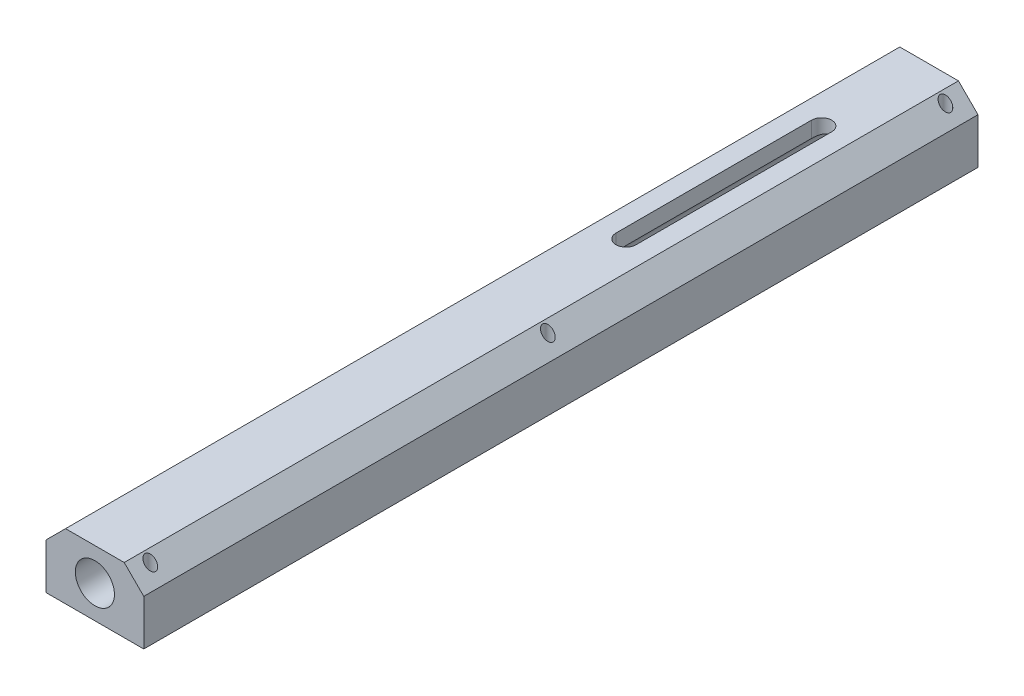
ISO-10303-21;
HEADER;
FILE_DESCRIPTION(('STEP AP214'),'2;1');
FILE_NAME('part.step','',(''),(''),'','','');
FILE_SCHEMA(('AUTOMOTIVE_DESIGN { 1 0 10303 214 1 1 1 1 }'));
ENDSEC;
DATA;
#1=APPLICATION_CONTEXT('core data for automotive mechanical design processes');
#2=APPLICATION_PROTOCOL_DEFINITION('international standard','automotive_design',2000,#1);
#3=PRODUCT_CONTEXT('',#1,'mechanical');
#4=PRODUCT('Part','Part','',(#3));
#5=PRODUCT_RELATED_PRODUCT_CATEGORY('part','',(#4));
#6=PRODUCT_DEFINITION_FORMATION('','',#4);
#7=PRODUCT_DEFINITION_CONTEXT('part definition',#1,'design');
#8=PRODUCT_DEFINITION('design','',#6,#7);
#9=PRODUCT_DEFINITION_SHAPE('','',#8);
#10=(LENGTH_UNIT() NAMED_UNIT(*) SI_UNIT(.MILLI.,.METRE.));
#11=(NAMED_UNIT(*) PLANE_ANGLE_UNIT() SI_UNIT($,.RADIAN.));
#12=(NAMED_UNIT(*) SI_UNIT($,.STERADIAN.) SOLID_ANGLE_UNIT());
#13=UNCERTAINTY_MEASURE_WITH_UNIT(LENGTH_MEASURE(1.E-05),#10,'distance_accuracy_value','');
#14=(GEOMETRIC_REPRESENTATION_CONTEXT(3) GLOBAL_UNCERTAINTY_ASSIGNED_CONTEXT((#13)) GLOBAL_UNIT_ASSIGNED_CONTEXT((#10,
#11,#12)) REPRESENTATION_CONTEXT('',''));
#15=CARTESIAN_POINT('',(0.,0.,0.));
#16=DIRECTION('',(0.,0.,1.));
#17=DIRECTION('',(1.,0.,0.));
#18=AXIS2_PLACEMENT_3D('',#15,#16,#17);
#19=CARTESIAN_POINT('',(-7.5,-5.,128.));
#20=DIRECTION('',(0.,1.,0.));
#21=DIRECTION('',(0.,0.,1.));
#22=AXIS2_PLACEMENT_3D('',#19,#20,#21);
#23=PLANE('',#22);
#24=CARTESIAN_POINT('',(-5.5,-5.,3.));
#25=DIRECTION('',(0.,-1.,0.));
#26=DIRECTION('',(0.,0.,-1.));
#27=AXIS2_PLACEMENT_3D('',#24,#25,#26);
#28=CIRCLE('',#27,0.799999999999999);
#29=CARTESIAN_POINT('',(-5.5,-5.,2.2));
#30=VERTEX_POINT('',#29);
#31=EDGE_CURVE('E555',#30,#30,#28,.T.);
#32=ORIENTED_EDGE('',*,*,#31,.F.);
#33=EDGE_LOOP('',(#32));
#34=FACE_BOUND('',#33,.T.);
#35=CARTESIAN_POINT('',(5.5,-5.,64.));
#36=DIRECTION('',(0.,-1.,0.));
#37=DIRECTION('',(0.,0.,-1.));
#38=AXIS2_PLACEMENT_3D('',#35,#36,#37);
#39=CIRCLE('',#38,0.799999999999999);
#40=CARTESIAN_POINT('',(5.5,-5.,63.2));
#41=VERTEX_POINT('',#40);
#42=EDGE_CURVE('E563',#41,#41,#39,.T.);
#43=ORIENTED_EDGE('',*,*,#42,.F.);
#44=EDGE_LOOP('',(#43));
#45=FACE_BOUND('',#44,.T.);
#46=CARTESIAN_POINT('',(-5.5,-5.,64.));
#47=DIRECTION('',(0.,-1.,0.));
#48=DIRECTION('',(0.,0.,-1.));
#49=AXIS2_PLACEMENT_3D('',#46,#47,#48);
#50=CIRCLE('',#49,0.799999999999999);
#51=CARTESIAN_POINT('',(-5.5,-5.,63.2));
#52=VERTEX_POINT('',#51);
#53=EDGE_CURVE('E567',#52,#52,#50,.T.);
#54=ORIENTED_EDGE('',*,*,#53,.F.);
#55=EDGE_LOOP('',(#54));
#56=FACE_BOUND('',#55,.T.);
#57=CARTESIAN_POINT('',(5.5,-5.,125.));
#58=DIRECTION('',(0.,-1.,0.));
#59=DIRECTION('',(0.,0.,-1.));
#60=AXIS2_PLACEMENT_3D('',#57,#58,#59);
#61=CIRCLE('',#60,0.799999999999999);
#62=CARTESIAN_POINT('',(5.5,-5.,124.2));
#63=VERTEX_POINT('',#62);
#64=EDGE_CURVE('E573',#63,#63,#61,.T.);
#65=ORIENTED_EDGE('',*,*,#64,.F.);
#66=EDGE_LOOP('',(#65));
#67=FACE_BOUND('',#66,.T.);
#68=CARTESIAN_POINT('',(-5.5,-5.,125.));
#69=DIRECTION('',(0.,-1.,0.));
#70=DIRECTION('',(0.,0.,-1.));
#71=AXIS2_PLACEMENT_3D('',#68,#69,#70);
#72=CIRCLE('',#71,0.799999999999999);
#73=CARTESIAN_POINT('',(-5.5,-5.,124.2));
#74=VERTEX_POINT('',#73);
#75=EDGE_CURVE('E576',#74,#74,#72,.T.);
#76=ORIENTED_EDGE('',*,*,#75,.F.);
#77=EDGE_LOOP('',(#76));
#78=FACE_BOUND('',#77,.T.);
#79=DIRECTION('',(0.,0.,-1.));
#80=VECTOR('',#79,1.);
#81=CARTESIAN_POINT('',(1.55,-5.,16.5));
#82=LINE('',#81,#80);
#83=CARTESIAN_POINT('',(1.55,-5.,46.5));
#84=VERTEX_POINT('',#83);
#85=CARTESIAN_POINT('',(1.55,-5.,16.5));
#86=VERTEX_POINT('',#85);
#87=EDGE_CURVE('E165',#84,#86,#82,.T.);
#88=ORIENTED_EDGE('',*,*,#87,.T.);
#89=CARTESIAN_POINT('',(0.,-5.,16.5));
#90=DIRECTION('',(0.,1.,0.));
#91=DIRECTION('',(0.,0.,1.));
#92=AXIS2_PLACEMENT_3D('',#89,#90,#91);
#93=CIRCLE('',#92,1.55);
#94=CARTESIAN_POINT('',(-1.55,-5.,16.5));
#95=VERTEX_POINT('',#94);
#96=EDGE_CURVE('E144',#86,#95,#93,.T.);
#97=ORIENTED_EDGE('',*,*,#96,.T.);
#98=DIRECTION('',(0.,0.,1.));
#99=VECTOR('',#98,1.);
#100=CARTESIAN_POINT('',(-1.55,-5.,16.5));
#101=LINE('',#100,#99);
#102=CARTESIAN_POINT('',(-1.55,-5.,46.5));
#103=VERTEX_POINT('',#102);
#104=EDGE_CURVE('E155',#95,#103,#101,.T.);
#105=ORIENTED_EDGE('',*,*,#104,.T.);
#106=CARTESIAN_POINT('',(0.,-5.,46.5));
#107=DIRECTION('',(0.,1.,0.));
#108=DIRECTION('',(0.,0.,1.));
#109=AXIS2_PLACEMENT_3D('',#106,#107,#108);
#110=CIRCLE('',#109,1.55);
#111=EDGE_CURVE('E161',#103,#84,#110,.T.);
#112=ORIENTED_EDGE('',*,*,#111,.T.);
#113=EDGE_LOOP('',(#88,#97,#105,#112));
#114=FACE_BOUND('',#113,.T.);
#115=DIRECTION('',(1.,0.,0.));
#116=VECTOR('',#115,1.);
#117=CARTESIAN_POINT('',(-7.5,-5.,0.));
#118=LINE('',#117,#116);
#119=CARTESIAN_POINT('',(-7.5,-5.,0.));
#120=VERTEX_POINT('',#119);
#121=CARTESIAN_POINT('',(7.5,-5.,0.));
#122=VERTEX_POINT('',#121);
#123=EDGE_CURVE('E210',#120,#122,#118,.T.);
#124=ORIENTED_EDGE('',*,*,#123,.T.);
#125=DIRECTION('',(0.,0.,-1.));
#126=VECTOR('',#125,1.);
#127=CARTESIAN_POINT('',(7.5,-5.,128.));
#128=LINE('',#127,#126);
#129=CARTESIAN_POINT('',(7.5,-5.,128.));
#130=VERTEX_POINT('',#129);
#131=EDGE_CURVE('E208',#130,#122,#128,.T.);
#132=ORIENTED_EDGE('',*,*,#131,.F.);
#133=DIRECTION('',(1.,0.,0.));
#134=VECTOR('',#133,1.);
#135=CARTESIAN_POINT('',(-7.5,-5.,128.));
#136=LINE('',#135,#134);
#137=CARTESIAN_POINT('',(-7.5,-5.,128.));
#138=VERTEX_POINT('',#137);
#139=EDGE_CURVE('E201',#138,#130,#136,.T.);
#140=ORIENTED_EDGE('',*,*,#139,.F.);
#141=DIRECTION('',(0.,0.,-1.));
#142=VECTOR('',#141,1.);
#143=CARTESIAN_POINT('',(-7.5,-5.,128.));
#144=LINE('',#143,#142);
#145=EDGE_CURVE('E218',#138,#120,#144,.T.);
#146=ORIENTED_EDGE('',*,*,#145,.T.);
#147=EDGE_LOOP('',(#124,#132,#140,#146));
#148=FACE_BOUND('',#147,.T.);
#149=CARTESIAN_POINT('',(5.5,-5.,3.));
#150=DIRECTION('',(0.,-1.,0.));
#151=DIRECTION('',(0.,0.,-1.));
#152=AXIS2_PLACEMENT_3D('',#149,#150,#151);
#153=CIRCLE('',#152,0.799999999999999);
#154=CARTESIAN_POINT('',(5.5,-5.,2.2));
#155=VERTEX_POINT('',#154);
#156=EDGE_CURVE('E553',#155,#155,#153,.T.);
#157=ORIENTED_EDGE('',*,*,#156,.F.);
#158=EDGE_LOOP('',(#157));
#159=FACE_BOUND('',#158,.T.);
#160=ADVANCED_FACE('F35',(#34,#45,#56,#67,#78,#114,#148,#159),#23,.F.);
#161=CARTESIAN_POINT('',(-7.5,5.,128.));
#162=DIRECTION('',(1.,0.,0.));
#163=DIRECTION('',(0.,1.,0.));
#164=AXIS2_PLACEMENT_3D('',#161,#162,#163);
#165=PLANE('',#164);
#166=DIRECTION('',(0.,-1.,0.));
#167=VECTOR('',#166,1.);
#168=CARTESIAN_POINT('',(-7.5,5.,128.));
#169=LINE('',#168,#167);
#170=CARTESIAN_POINT('',(-7.5,2.,128.));
#171=VERTEX_POINT('',#170);
#172=EDGE_CURVE('E199',#171,#138,#169,.T.);
#173=ORIENTED_EDGE('',*,*,#172,.F.);
#174=DIRECTION('',(0.,0.,-1.));
#175=VECTOR('',#174,1.);
#176=CARTESIAN_POINT('',(-7.5,2.,128.));
#177=LINE('',#176,#175);
#178=CARTESIAN_POINT('',(-7.5,2.,0.));
#179=VERTEX_POINT('',#178);
#180=EDGE_CURVE('E11',#171,#179,#177,.T.);
#181=ORIENTED_EDGE('',*,*,#180,.T.);
#182=DIRECTION('',(0.,-1.,0.));
#183=VECTOR('',#182,1.);
#184=CARTESIAN_POINT('',(-7.5,5.,0.));
#185=LINE('',#184,#183);
#186=EDGE_CURVE('E196',#179,#120,#185,.T.);
#187=ORIENTED_EDGE('',*,*,#186,.T.);
#188=ORIENTED_EDGE('',*,*,#145,.F.);
#189=EDGE_LOOP('',(#173,#181,#187,#188));
#190=FACE_BOUND('',#189,.T.);
#191=ADVANCED_FACE('F306',(#190),#165,.F.);
#192=CARTESIAN_POINT('',(7.5,5.,128.));
#193=DIRECTION('',(-1.,0.,0.));
#194=DIRECTION('',(0.,-1.,0.));
#195=AXIS2_PLACEMENT_3D('',#192,#193,#194);
#196=PLANE('',#195);
#197=DIRECTION('',(0.,1.,0.));
#198=VECTOR('',#197,1.);
#199=CARTESIAN_POINT('',(7.5,5.,0.));
#200=LINE('',#199,#198);
#201=CARTESIAN_POINT('',(7.5,2.,0.));
#202=VERTEX_POINT('',#201);
#203=EDGE_CURVE('E212',#122,#202,#200,.T.);
#204=ORIENTED_EDGE('',*,*,#203,.T.);
#205=DIRECTION('',(0.,0.,1.));
#206=VECTOR('',#205,1.);
#207=CARTESIAN_POINT('',(7.5,2.,128.));
#208=LINE('',#207,#206);
#209=CARTESIAN_POINT('',(7.5,2.,128.));
#210=VERTEX_POINT('',#209);
#211=EDGE_CURVE('E58',#202,#210,#208,.T.);
#212=ORIENTED_EDGE('',*,*,#211,.T.);
#213=DIRECTION('',(0.,1.,0.));
#214=VECTOR('',#213,1.);
#215=CARTESIAN_POINT('',(7.5,5.,128.));
#216=LINE('',#215,#214);
#217=EDGE_CURVE('E204',#130,#210,#216,.T.);
#218=ORIENTED_EDGE('',*,*,#217,.F.);
#219=ORIENTED_EDGE('',*,*,#131,.T.);
#220=EDGE_LOOP('',(#204,#212,#218,#219));
#221=FACE_BOUND('',#220,.T.);
#222=ADVANCED_FACE('F312',(#221),#196,.F.);
#223=CARTESIAN_POINT('',(-7.5,5.,128.));
#224=DIRECTION('',(0.,-1.,0.));
#225=DIRECTION('',(1.,0.,0.));
#226=AXIS2_PLACEMENT_3D('',#223,#224,#225);
#227=PLANE('',#226);
#228=DIRECTION('',(0.,0.,1.));
#229=VECTOR('',#228,1.);
#230=CARTESIAN_POINT('',(-1.55,5.,16.5));
#231=LINE('',#230,#229);
#232=CARTESIAN_POINT('',(-1.55,5.,16.5));
#233=VERTEX_POINT('',#232);
#234=CARTESIAN_POINT('',(-1.55,5.,46.5));
#235=VERTEX_POINT('',#234);
#236=EDGE_CURVE('E179',#233,#235,#231,.T.);
#237=ORIENTED_EDGE('',*,*,#236,.F.);
#238=CARTESIAN_POINT('',(0.,5.,16.5));
#239=DIRECTION('',(0.,1.,0.));
#240=DIRECTION('',(0.,0.,1.));
#241=AXIS2_PLACEMENT_3D('',#238,#239,#240);
#242=CIRCLE('',#241,1.55);
#243=CARTESIAN_POINT('',(1.55,5.,16.5));
#244=VERTEX_POINT('',#243);
#245=EDGE_CURVE('E177',#244,#233,#242,.T.);
#246=ORIENTED_EDGE('',*,*,#245,.F.);
#247=DIRECTION('',(0.,0.,-1.));
#248=VECTOR('',#247,1.);
#249=CARTESIAN_POINT('',(1.55,5.,16.5));
#250=LINE('',#249,#248);
#251=CARTESIAN_POINT('',(1.55,5.,46.5));
#252=VERTEX_POINT('',#251);
#253=EDGE_CURVE('E166',#252,#244,#250,.T.);
#254=ORIENTED_EDGE('',*,*,#253,.F.);
#255=CARTESIAN_POINT('',(0.,5.,46.5));
#256=DIRECTION('',(0.,1.,0.));
#257=DIRECTION('',(0.,0.,1.));
#258=AXIS2_PLACEMENT_3D('',#255,#256,#257);
#259=CIRCLE('',#258,1.55);
#260=EDGE_CURVE('E169',#235,#252,#259,.T.);
#261=ORIENTED_EDGE('',*,*,#260,.F.);
#262=EDGE_LOOP('',(#237,#246,#254,#261));
#263=FACE_BOUND('',#262,.T.);
#264=DIRECTION('',(-1.,0.,0.));
#265=VECTOR('',#264,1.);
#266=CARTESIAN_POINT('',(-7.5,5.,128.));
#267=LINE('',#266,#265);
#268=CARTESIAN_POINT('',(4.5,5.,128.));
#269=VERTEX_POINT('',#268);
#270=CARTESIAN_POINT('',(-4.49999999999998,5.,128.));
#271=VERTEX_POINT('',#270);
#272=EDGE_CURVE('E206',#269,#271,#267,.T.);
#273=ORIENTED_EDGE('',*,*,#272,.F.);
#274=DIRECTION('',(0.,0.,-1.));
#275=VECTOR('',#274,1.);
#276=CARTESIAN_POINT('',(4.5,5.,128.));
#277=LINE('',#276,#275);
#278=CARTESIAN_POINT('',(4.5,5.,0.));
#279=VERTEX_POINT('',#278);
#280=EDGE_CURVE('E341',#269,#279,#277,.T.);
#281=ORIENTED_EDGE('',*,*,#280,.T.);
#282=DIRECTION('',(-1.,0.,0.));
#283=VECTOR('',#282,1.);
#284=CARTESIAN_POINT('',(-7.5,5.,0.));
#285=LINE('',#284,#283);
#286=CARTESIAN_POINT('',(-4.49999999999998,5.,0.));
#287=VERTEX_POINT('',#286);
#288=EDGE_CURVE('E202',#279,#287,#285,.T.);
#289=ORIENTED_EDGE('',*,*,#288,.T.);
#290=DIRECTION('',(0.,0.,1.));
#291=VECTOR('',#290,1.);
#292=CARTESIAN_POINT('',(-4.49999999999998,5.,128.));
#293=LINE('',#292,#291);
#294=EDGE_CURVE('E265',#287,#271,#293,.T.);
#295=ORIENTED_EDGE('',*,*,#294,.T.);
#296=EDGE_LOOP('',(#273,#281,#289,#295));
#297=FACE_BOUND('',#296,.T.);
#298=ADVANCED_FACE('F289',(#263,#297),#227,.F.);
#299=CARTESIAN_POINT('',(0.,0.,128.));
#300=DIRECTION('',(0.,0.,1.));
#301=DIRECTION('',(1.,0.,0.));
#302=AXIS2_PLACEMENT_3D('',#299,#300,#301);
#303=PLANE('',#302);
#304=CARTESIAN_POINT('',(0.,0.,128.));
#305=DIRECTION('',(0.,0.,1.));
#306=DIRECTION('',(1.,0.,0.));
#307=AXIS2_PLACEMENT_3D('',#304,#305,#306);
#308=CIRCLE('',#307,3.);
#309=CARTESIAN_POINT('',(3.,0.,128.));
#310=VERTEX_POINT('',#309);
#311=EDGE_CURVE('E186',#310,#310,#308,.T.);
#312=ORIENTED_EDGE('',*,*,#311,.F.);
#313=EDGE_LOOP('',(#312));
#314=FACE_BOUND('',#313,.T.);
#315=ORIENTED_EDGE('',*,*,#217,.T.);
#316=DIRECTION('',(0.707106781186548,-0.707106781186547,0.));
#317=VECTOR('',#316,1.);
#318=CARTESIAN_POINT('',(4.75,4.75,128.));
#319=LINE('',#318,#317);
#320=EDGE_CURVE('E43',#210,#269,#319,.F.);
#321=ORIENTED_EDGE('',*,*,#320,.T.);
#322=ORIENTED_EDGE('',*,*,#272,.T.);
#323=DIRECTION('',(0.707106781186549,0.707106781186546,0.));
#324=VECTOR('',#323,1.);
#325=CARTESIAN_POINT('',(-4.74999999999998,4.75,128.));
#326=LINE('',#325,#324);
#327=EDGE_CURVE('E50',#271,#171,#326,.F.);
#328=ORIENTED_EDGE('',*,*,#327,.T.);
#329=ORIENTED_EDGE('',*,*,#172,.T.);
#330=ORIENTED_EDGE('',*,*,#139,.T.);
#331=EDGE_LOOP('',(#315,#321,#322,#328,#329,#330));
#332=FACE_BOUND('',#331,.T.);
#333=ADVANCED_FACE('F352',(#314,#332),#303,.T.);
#334=CARTESIAN_POINT('',(0.,0.,0.));
#335=DIRECTION('',(0.,0.,1.));
#336=DIRECTION('',(1.,0.,0.));
#337=AXIS2_PLACEMENT_3D('',#334,#335,#336);
#338=PLANE('',#337);
#339=CARTESIAN_POINT('',(0.,0.,0.));
#340=DIRECTION('',(0.,0.,1.));
#341=DIRECTION('',(1.,0.,0.));
#342=AXIS2_PLACEMENT_3D('',#339,#340,#341);
#343=CIRCLE('',#342,3.);
#344=CARTESIAN_POINT('',(3.,0.,0.));
#345=VERTEX_POINT('',#344);
#346=EDGE_CURVE('E193',#345,#345,#343,.T.);
#347=ORIENTED_EDGE('',*,*,#346,.T.);
#348=EDGE_LOOP('',(#347));
#349=FACE_BOUND('',#348,.T.);
#350=ORIENTED_EDGE('',*,*,#288,.F.);
#351=DIRECTION('',(-0.707106781186548,0.707106781186547,0.));
#352=VECTOR('',#351,1.);
#353=CARTESIAN_POINT('',(4.5,5.,0.));
#354=LINE('',#353,#352);
#355=EDGE_CURVE('E346',#279,#202,#354,.F.);
#356=ORIENTED_EDGE('',*,*,#355,.T.);
#357=ORIENTED_EDGE('',*,*,#203,.F.);
#358=ORIENTED_EDGE('',*,*,#123,.F.);
#359=ORIENTED_EDGE('',*,*,#186,.F.);
#360=DIRECTION('',(-0.707106781186549,-0.707106781186546,0.));
#361=VECTOR('',#360,1.);
#362=CARTESIAN_POINT('',(-7.5,2.,0.));
#363=LINE('',#362,#361);
#364=EDGE_CURVE('E348',#179,#287,#363,.F.);
#365=ORIENTED_EDGE('',*,*,#364,.T.);
#366=EDGE_LOOP('',(#350,#356,#357,#358,#359,#365));
#367=FACE_BOUND('',#366,.T.);
#368=ADVANCED_FACE('F301',(#349,#367),#338,.F.);
#369=CARTESIAN_POINT('',(0.,0.,0.));
#370=DIRECTION('',(0.,0.,1.));
#371=DIRECTION('',(1.,0.,0.));
#372=AXIS2_PLACEMENT_3D('',#369,#370,#371);
#373=CYLINDRICAL_SURFACE('',#372,3.);
#374=DIRECTION('',(0.,0.,1.));
#375=VECTOR('',#374,1.);
#376=CARTESIAN_POINT('',(-1.55,-2.56855990780826,0.));
#377=LINE('',#376,#375);
#378=CARTESIAN_POINT('',(-1.55,-2.56855990780826,46.5));
#379=VERTEX_POINT('',#378);
#380=CARTESIAN_POINT('',(-1.55,-2.56855990780826,16.5));
#381=VERTEX_POINT('',#380);
#382=EDGE_CURVE('E258',#379,#381,#377,.F.);
#383=ORIENTED_EDGE('',*,*,#382,.T.);
#384=CARTESIAN_POINT('',(-1.55,-2.56855990780827,16.5));
#385=CARTESIAN_POINT('',(-1.55000325911588,-2.56855131423425,16.4596078876841));
#386=CARTESIAN_POINT('',(-1.54842008811431,-2.56951386249306,16.4192390917681));
#387=CARTESIAN_POINT('',(-1.54212741895229,-2.57329822025658,16.3388598777798));
#388=CARTESIAN_POINT('',(-1.53741999562099,-2.57611879582824,16.2988492397135));
#389=CARTESIAN_POINT('',(-1.51876441125574,-2.58719380973226,16.180291011719));
#390=CARTESIAN_POINT('',(-1.50028142727033,-2.59806386562294,16.102650076527));
#391=CARTESIAN_POINT('',(-1.45213430707905,-2.62527236683728,15.9522354959461));
#392=CARTESIAN_POINT('',(-1.42249519712639,-2.64159856341572,15.879451382453));
#393=CARTESIAN_POINT('',(-1.35301847357807,-2.67784913898162,15.7397793093859));
#394=CARTESIAN_POINT('',(-1.31316392625474,-2.69777947609884,15.6729013901898));
#395=CARTESIAN_POINT('',(-1.22031605513712,-2.74110798751298,15.5406144853931));
#396=CARTESIAN_POINT('',(-1.16647703042271,-2.76465700129495,15.4758486235379));
#397=CARTESIAN_POINT('',(-1.04895271944088,-2.81135151947642,15.3557715609075));
#398=CARTESIAN_POINT('',(-0.98526463652275,-2.83449690718219,15.3004630549809));
#399=CARTESIAN_POINT('',(-0.844142452160648,-2.87980934357678,15.1968769357708));
#400=CARTESIAN_POINT('',(-0.766042920809648,-2.90178028688266,15.1494119764151));
#401=CARTESIAN_POINT('',(-0.601617574598474,-2.94026599826775,15.0685914761812));
#402=CARTESIAN_POINT('',(-0.515297248157472,-2.95678437417448,15.0352266015164));
#403=CARTESIAN_POINT('',(-0.34375206688228,-2.98140389219349,14.9861692239297));
#404=CARTESIAN_POINT('',(-0.258932261408523,-2.9900442406009,14.9693372010971));
#405=CARTESIAN_POINT('',(-0.0872666005139904,-2.99995963001846,14.9500546830422));
#406=CARTESIAN_POINT('',(-0.000422071868088985,-3.00123936530146,14.9475950217486));
#407=CARTESIAN_POINT('',(0.164195057750389,-2.99653015703522,14.9567240151537));
#408=CARTESIAN_POINT('',(0.242062319378158,-2.99120404970563,14.9670314756814));
#409=CARTESIAN_POINT('',(0.394776661551257,-2.97490323334359,14.9990871633236));
#410=CARTESIAN_POINT('',(0.469623570628814,-2.96392820410257,15.0208360389951));
#411=CARTESIAN_POINT('',(0.615422938252004,-2.93714586364805,15.0752570752933));
#412=CARTESIAN_POINT('',(0.686312023038214,-2.92127751222654,15.108067734648));
#413=CARTESIAN_POINT('',(0.82174138285225,-2.88611217091073,15.1834686918018));
#414=CARTESIAN_POINT('',(0.886279356221716,-2.86681394507912,15.2260625165362));
#415=CARTESIAN_POINT('',(1.01399918830875,-2.82431789095171,15.3246519701554));
#416=CARTESIAN_POINT('',(1.07641384441618,-2.80092314165808,15.3815570598368));
#417=CARTESIAN_POINT('',(1.19125227241975,-2.75404674097164,15.5047517623613));
#418=CARTESIAN_POINT('',(1.24366598862783,-2.73056502606201,15.5710507050121));
#419=CARTESIAN_POINT('',(1.34071242939525,-2.68432207722154,15.716925629798));
#420=CARTESIAN_POINT('',(1.38451545502006,-2.66173384653833,15.7971133170293));
#421=CARTESIAN_POINT('',(1.45762700884423,-2.62241472617311,15.9650553567338));
#422=CARTESIAN_POINT('',(1.48697245596951,-2.60566894946495,16.0527897570749));
#423=CARTESIAN_POINT('',(1.52205775937805,-2.5852660389101,16.201002761933));
#424=CARTESIAN_POINT('',(1.53248306834913,-2.57907121725935,16.2600524446571));
#425=CARTESIAN_POINT('',(1.54647591927963,-2.57068715872253,16.3793762417494));
#426=CARTESIAN_POINT('',(1.55002698130994,-2.56850754827887,16.4396529493452));
#427=CARTESIAN_POINT('',(1.55,-2.56855990780827,16.5));
#428=B_SPLINE_CURVE_WITH_KNOTS('',3,(#384,#385,#386,#387,#388,#389,#390,#391,#392,#393,#394,
#395,#396,#397,#398,#399,#400,#401,#402,#403,#404,#405,#406,#407,#408,#409,#410,#411,#412,#413,
#414,#415,#416,#417,#418,#419,#420,#421,#422,#423,#424,#425,#426,#427),.UNSPECIFIED.,.F.,.F.,(4,
2,2,2,2,2,2,2,2,2,2,2,2,2,2,2,2,2,2,2,2,4),(0.,0.121089655469636,0.242098975147689,
0.482441190309218,0.722247434441772,0.962453796158042,1.22372481440542,1.48507015752429,
1.76557423720221,2.04589234055143,2.30514741615097,2.5642371320039,2.79930824264188,
3.03439267972971,3.27253710895289,3.51076752690893,3.77258967543859,4.03467370795555,
4.31558938422592,4.59578394620296,4.7761268586752,4.95690158217857),.UNSPECIFIED.);
#429=CARTESIAN_POINT('',(1.55,-2.56855990780827,16.5));
#430=VERTEX_POINT('',#429);
#431=EDGE_CURVE('E147',#381,#430,#428,.T.);
#432=ORIENTED_EDGE('',*,*,#431,.T.);
#433=DIRECTION('',(0.,0.,1.));
#434=VECTOR('',#433,1.);
#435=CARTESIAN_POINT('',(1.55,-2.56855990780827,0.));
#436=LINE('',#435,#434);
#437=CARTESIAN_POINT('',(1.55,-2.56855990780826,46.5));
#438=VERTEX_POINT('',#437);
#439=EDGE_CURVE('E257',#430,#438,#436,.T.);
#440=ORIENTED_EDGE('',*,*,#439,.T.);
#441=CARTESIAN_POINT('',(1.55,-2.56855990780826,46.5));
#442=CARTESIAN_POINT('',(1.55000325911588,-2.56855131423424,46.5403921123159));
#443=CARTESIAN_POINT('',(1.54842008811431,-2.56951386249306,46.5807609082319));
#444=CARTESIAN_POINT('',(1.54212741895229,-2.57329822025658,46.6611401222203));
#445=CARTESIAN_POINT('',(1.53741999562099,-2.57611879582824,46.7011507602865));
#446=CARTESIAN_POINT('',(1.51876441125575,-2.58719380973226,46.819708988281));
#447=CARTESIAN_POINT('',(1.50028142727034,-2.59806386562294,46.897349923473));
#448=CARTESIAN_POINT('',(1.45213430707906,-2.62527236683728,47.0477645040539));
#449=CARTESIAN_POINT('',(1.42249519712639,-2.64159856341572,47.120548617547));
#450=CARTESIAN_POINT('',(1.35301847357808,-2.67784913898161,47.2602206906141));
#451=CARTESIAN_POINT('',(1.31316392625474,-2.69777947609884,47.3270986098102));
#452=CARTESIAN_POINT('',(1.22031605513712,-2.74110798751298,47.4593855146069));
#453=CARTESIAN_POINT('',(1.16647703042272,-2.76465700129495,47.5241513764621));
#454=CARTESIAN_POINT('',(1.04895271944089,-2.81135151947642,47.6442284390925));
#455=CARTESIAN_POINT('',(0.985264636522757,-2.83449690718219,47.6995369450191));
#456=CARTESIAN_POINT('',(0.844142452160654,-2.87980934357678,47.8031230642292));
#457=CARTESIAN_POINT('',(0.766042920809653,-2.90178028688266,47.8505880235849));
#458=CARTESIAN_POINT('',(0.60161757459848,-2.94026599826775,47.9314085238188));
#459=CARTESIAN_POINT('',(0.515297248157478,-2.95678437417448,47.9647733984836));
#460=CARTESIAN_POINT('',(0.343752066882285,-2.98140389219349,48.0138307760703));
#461=CARTESIAN_POINT('',(0.258932261408527,-2.9900442406009,48.0306627989029));
#462=CARTESIAN_POINT('',(0.0872666005139931,-2.99995963001846,48.0499453169578));
#463=CARTESIAN_POINT('',(0.000422071868091316,-3.00123936530146,48.0524049782514));
#464=CARTESIAN_POINT('',(-0.164195057750387,-2.99653015703522,48.0432759848463));
#465=CARTESIAN_POINT('',(-0.242062319378156,-2.99120404970563,48.0329685243186));
#466=CARTESIAN_POINT('',(-0.394776661551255,-2.97490323334359,48.0009128366764));
#467=CARTESIAN_POINT('',(-0.469623570628812,-2.96392820410257,47.9791639610049));
#468=CARTESIAN_POINT('',(-0.615422938252002,-2.93714586364805,47.9247429247067));
#469=CARTESIAN_POINT('',(-0.686312023038212,-2.92127751222654,47.891932265352));
#470=CARTESIAN_POINT('',(-0.821741382852247,-2.88611217091074,47.8165313081982));
#471=CARTESIAN_POINT('',(-0.886279356221713,-2.86681394507912,47.7739374834638));
#472=CARTESIAN_POINT('',(-1.01399918830875,-2.82431789095171,47.6753480298446));
#473=CARTESIAN_POINT('',(-1.07641384441618,-2.80092314165808,47.6184429401632));
#474=CARTESIAN_POINT('',(-1.19125227241975,-2.75404674097164,47.4952482376387));
#475=CARTESIAN_POINT('',(-1.24366598862783,-2.73056502606201,47.4289492949879));
#476=CARTESIAN_POINT('',(-1.34071242939524,-2.68432207722154,47.283074370202));
#477=CARTESIAN_POINT('',(-1.38451545502006,-2.66173384653833,47.2028866829707));
#478=CARTESIAN_POINT('',(-1.45762700884422,-2.62241472617311,47.0349446432662));
#479=CARTESIAN_POINT('',(-1.48697245596951,-2.60566894946495,46.9472102429251));
#480=CARTESIAN_POINT('',(-1.52205775937805,-2.58526603891011,46.798997238067));
#481=CARTESIAN_POINT('',(-1.53248306834912,-2.57907121725935,46.7399475553429));
#482=CARTESIAN_POINT('',(-1.54647591927963,-2.57068715872253,46.6206237582506));
#483=CARTESIAN_POINT('',(-1.55002698130993,-2.56850754827887,46.5603470506548));
#484=CARTESIAN_POINT('',(-1.55,-2.56855990780827,46.5));
#485=B_SPLINE_CURVE_WITH_KNOTS('',3,(#441,#442,#443,#444,#445,#446,#447,#448,#449,#450,#451,
#452,#453,#454,#455,#456,#457,#458,#459,#460,#461,#462,#463,#464,#465,#466,#467,#468,#469,#470,
#471,#472,#473,#474,#475,#476,#477,#478,#479,#480,#481,#482,#483,#484),.UNSPECIFIED.,.F.,.F.,(4,
2,2,2,2,2,2,2,2,2,2,2,2,2,2,2,2,2,2,2,2,4),(0.,0.121089655469632,0.242098975147693,
0.482441190309219,0.722247434441768,0.962453796158044,1.22372481440542,1.48507015752429,
1.76557423720221,2.04589234055143,2.30514741615097,2.5642371320039,2.79930824264189,
3.03439267972972,3.27253710895289,3.51076752690893,3.77258967543859,4.03467370795555,
4.31558938422592,4.59578394620296,4.77612685867521,4.95690158217857),.UNSPECIFIED.);
#486=EDGE_CURVE('E250',#438,#379,#485,.T.);
#487=ORIENTED_EDGE('',*,*,#486,.T.);
#488=EDGE_LOOP('',(#383,#432,#440,#487));
#489=FACE_BOUND('',#488,.T.);
#490=DIRECTION('',(0.,0.,1.));
#491=VECTOR('',#490,1.);
#492=CARTESIAN_POINT('',(1.55,2.56855990780827,0.));
#493=LINE('',#492,#491);
#494=CARTESIAN_POINT('',(1.55,2.56855990780826,46.5));
#495=VERTEX_POINT('',#494);
#496=CARTESIAN_POINT('',(1.55,2.56855990780827,16.5));
#497=VERTEX_POINT('',#496);
#498=EDGE_CURVE('E232',#495,#497,#493,.F.);
#499=ORIENTED_EDGE('',*,*,#498,.T.);
#500=CARTESIAN_POINT('',(1.55,2.56855990780827,16.5));
#501=CARTESIAN_POINT('',(1.55000325911588,2.56855131423425,16.4596078876841));
#502=CARTESIAN_POINT('',(1.54842008811431,2.56951386249306,16.4192390917681));
#503=CARTESIAN_POINT('',(1.54212741895229,2.57329822025658,16.3388598777798));
#504=CARTESIAN_POINT('',(1.53741999562099,2.57611879582824,16.2988492397135));
#505=CARTESIAN_POINT('',(1.51876441125574,2.58719380973226,16.180291011719));
#506=CARTESIAN_POINT('',(1.50028142727033,2.59806386562294,16.102650076527));
#507=CARTESIAN_POINT('',(1.45213430707905,2.62527236683729,15.9522354959461));
#508=CARTESIAN_POINT('',(1.42249519712639,2.64159856341572,15.879451382453));
#509=CARTESIAN_POINT('',(1.35301847357807,2.67784913898162,15.7397793093859));
#510=CARTESIAN_POINT('',(1.31316392625474,2.69777947609884,15.6729013901898));
#511=CARTESIAN_POINT('',(1.22031605513712,2.74110798751298,15.5406144853931));
#512=CARTESIAN_POINT('',(1.16647703042271,2.76465700129495,15.4758486235379));
#513=CARTESIAN_POINT('',(1.04895271944088,2.81135151947642,15.3557715609075));
#514=CARTESIAN_POINT('',(0.985264636522751,2.83449690718219,15.3004630549809));
#515=CARTESIAN_POINT('',(0.844142452160649,2.87980934357678,15.1968769357708));
#516=CARTESIAN_POINT('',(0.766042920809648,2.90178028688266,15.1494119764151));
#517=CARTESIAN_POINT('',(0.601617574598475,2.94026599826775,15.0685914761812));
#518=CARTESIAN_POINT('',(0.515297248157472,2.95678437417448,15.0352266015164));
#519=CARTESIAN_POINT('',(0.343752066882281,2.98140389219349,14.9861692239297));
#520=CARTESIAN_POINT('',(0.258932261408524,2.9900442406009,14.9693372010971));
#521=CARTESIAN_POINT('',(0.087266600513991,2.99995963001846,14.9500546830422));
#522=CARTESIAN_POINT('',(0.0004220718680895,3.00123936530146,14.9475950217486));
#523=CARTESIAN_POINT('',(-0.164195057750389,2.99653015703522,14.9567240151537));
#524=CARTESIAN_POINT('',(-0.242062319378158,2.99120404970563,14.9670314756814));
#525=CARTESIAN_POINT('',(-0.394776661551256,2.97490323334359,14.9990871633236));
#526=CARTESIAN_POINT('',(-0.469623570628813,2.96392820410257,15.0208360389951));
#527=CARTESIAN_POINT('',(-0.615422938252003,2.93714586364805,15.0752570752933));
#528=CARTESIAN_POINT('',(-0.686312023038214,2.92127751222654,15.108067734648));
#529=CARTESIAN_POINT('',(-0.82174138285225,2.88611217091073,15.1834686918018));
#530=CARTESIAN_POINT('',(-0.886279356221715,2.86681394507912,15.2260625165362));
#531=CARTESIAN_POINT('',(-1.01399918830875,2.82431789095171,15.3246519701554));
#532=CARTESIAN_POINT('',(-1.07641384441618,2.80092314165808,15.3815570598368));
#533=CARTESIAN_POINT('',(-1.19125227241975,2.75404674097164,15.5047517623613));
#534=CARTESIAN_POINT('',(-1.24366598862783,2.73056502606201,15.5710507050121));
#535=CARTESIAN_POINT('',(-1.34071242939525,2.68432207722154,15.716925629798));
#536=CARTESIAN_POINT('',(-1.38451545502006,2.66173384653833,15.7971133170293));
#537=CARTESIAN_POINT('',(-1.45762700884423,2.62241472617311,15.9650553567338));
#538=CARTESIAN_POINT('',(-1.48697245596951,2.60566894946495,16.0527897570749));
#539=CARTESIAN_POINT('',(-1.52205775937805,2.5852660389101,16.201002761933));
#540=CARTESIAN_POINT('',(-1.53248306834913,2.57907121725935,16.2600524446571));
#541=CARTESIAN_POINT('',(-1.54647591927963,2.57068715872253,16.3793762417494));
#542=CARTESIAN_POINT('',(-1.55002698130994,2.56850754827887,16.4396529493452));
#543=CARTESIAN_POINT('',(-1.55,2.56855990780827,16.5));
#544=B_SPLINE_CURVE_WITH_KNOTS('',3,(#500,#501,#502,#503,#504,#505,#506,#507,#508,#509,#510,
#511,#512,#513,#514,#515,#516,#517,#518,#519,#520,#521,#522,#523,#524,#525,#526,#527,#528,#529,
#530,#531,#532,#533,#534,#535,#536,#537,#538,#539,#540,#541,#542,#543),.UNSPECIFIED.,.F.,.F.,(4,
2,2,2,2,2,2,2,2,2,2,2,2,2,2,2,2,2,2,2,2,4),(0.,0.121089655469636,0.242098975147689,
0.482441190309219,0.722247434441769,0.962453796158042,1.22372481440542,1.48507015752429,
1.76557423720221,2.04589234055143,2.30514741615097,2.5642371320039,2.79930824264188,
3.03439267972971,3.27253710895289,3.51076752690893,3.77258967543859,4.03467370795555,
4.31558938422592,4.59578394620296,4.7761268586752,4.95690158217857),.UNSPECIFIED.);
#545=CARTESIAN_POINT('',(-1.55,2.56855990780826,16.5));
#546=VERTEX_POINT('',#545);
#547=EDGE_CURVE('E271',#497,#546,#544,.T.);
#548=ORIENTED_EDGE('',*,*,#547,.T.);
#549=DIRECTION('',(0.,0.,1.));
#550=VECTOR('',#549,1.);
#551=CARTESIAN_POINT('',(-1.55,2.56855990780826,0.));
#552=LINE('',#551,#550);
#553=CARTESIAN_POINT('',(-1.55,2.56855990780826,46.5));
#554=VERTEX_POINT('',#553);
#555=EDGE_CURVE('E221',#546,#554,#552,.T.);
#556=ORIENTED_EDGE('',*,*,#555,.T.);
#557=CARTESIAN_POINT('',(-1.55,2.56855990780827,46.5));
#558=CARTESIAN_POINT('',(-1.55000325911588,2.56855131423425,46.5403921123159));
#559=CARTESIAN_POINT('',(-1.5484200881143,2.56951386249307,46.5807609082319));
#560=CARTESIAN_POINT('',(-1.54212741895228,2.57329822025658,46.6611401222203));
#561=CARTESIAN_POINT('',(-1.53741999562098,2.57611879582824,46.7011507602865));
#562=CARTESIAN_POINT('',(-1.51876441125574,2.58719380973226,46.819708988281));
#563=CARTESIAN_POINT('',(-1.50028142727033,2.59806386562295,46.897349923473));
#564=CARTESIAN_POINT('',(-1.45213430707905,2.62527236683729,47.0477645040539));
#565=CARTESIAN_POINT('',(-1.42249519712638,2.64159856341572,47.120548617547));
#566=CARTESIAN_POINT('',(-1.35301847357807,2.67784913898162,47.2602206906141));
#567=CARTESIAN_POINT('',(-1.31316392625473,2.69777947609885,47.3270986098102));
#568=CARTESIAN_POINT('',(-1.22031605513712,2.74110798751298,47.4593855146069));
#569=CARTESIAN_POINT('',(-1.16647703042271,2.76465700129495,47.5241513764621));
#570=CARTESIAN_POINT('',(-1.04895271944088,2.81135151947642,47.6442284390925));
#571=CARTESIAN_POINT('',(-0.985264636522749,2.83449690718219,47.6995369450191));
#572=CARTESIAN_POINT('',(-0.844142452160646,2.87980934357678,47.8031230642292));
#573=CARTESIAN_POINT('',(-0.766042920809645,2.90178028688266,47.8505880235849));
#574=CARTESIAN_POINT('',(-0.601617574598471,2.94026599826775,47.9314085238188));
#575=CARTESIAN_POINT('',(-0.515297248157469,2.95678437417448,47.9647733984836));
#576=CARTESIAN_POINT('',(-0.343752066882277,2.9814038921935,48.0138307760703));
#577=CARTESIAN_POINT('',(-0.258932261408519,2.9900442406009,48.0306627989029));
#578=CARTESIAN_POINT('',(-0.0872666005139852,2.99995963001846,48.0499453169578));
#579=CARTESIAN_POINT('',(-0.000422071868083157,3.00123936530146,48.0524049782514));
#580=CARTESIAN_POINT('',(0.164195057750396,2.99653015703522,48.0432759848463));
#581=CARTESIAN_POINT('',(0.242062319378164,2.99120404970563,48.0329685243186));
#582=CARTESIAN_POINT('',(0.394776661551263,2.97490323334359,48.0009128366764));
#583=CARTESIAN_POINT('',(0.46962357062882,2.96392820410257,47.9791639610049));
#584=CARTESIAN_POINT('',(0.61542293825201,2.93714586364805,47.9247429247067));
#585=CARTESIAN_POINT('',(0.686312023038219,2.92127751222654,47.891932265352));
#586=CARTESIAN_POINT('',(0.821741382852254,2.88611217091073,47.8165313081982));
#587=CARTESIAN_POINT('',(0.88627935622172,2.86681394507912,47.7739374834638));
#588=CARTESIAN_POINT('',(1.01399918830876,2.82431789095171,47.6753480298446));
#589=CARTESIAN_POINT('',(1.07641384441618,2.80092314165808,47.6184429401632));
#590=CARTESIAN_POINT('',(1.19125227241976,2.75404674097164,47.4952482376387));
#591=CARTESIAN_POINT('',(1.24366598862784,2.730565026062,47.4289492949879));
#592=CARTESIAN_POINT('',(1.34071242939525,2.68432207722154,47.283074370202));
#593=CARTESIAN_POINT('',(1.38451545502007,2.66173384653833,47.2028866829707));
#594=CARTESIAN_POINT('',(1.45762700884423,2.6224147261731,47.0349446432662));
#595=CARTESIAN_POINT('',(1.48697245596952,2.60566894946495,46.9472102429251));
#596=CARTESIAN_POINT('',(1.52205775937805,2.5852660389101,46.798997238067));
#597=CARTESIAN_POINT('',(1.53248306834913,2.57907121725934,46.7399475553428));
#598=CARTESIAN_POINT('',(1.54647591927964,2.57068715872253,46.6206237582506));
#599=CARTESIAN_POINT('',(1.55002698130994,2.56850754827887,46.5603470506548));
#600=CARTESIAN_POINT('',(1.55,2.56855990780826,46.5));
#601=B_SPLINE_CURVE_WITH_KNOTS('',3,(#557,#558,#559,#560,#561,#562,#563,#564,#565,#566,#567,
#568,#569,#570,#571,#572,#573,#574,#575,#576,#577,#578,#579,#580,#581,#582,#583,#584,#585,#586,
#587,#588,#589,#590,#591,#592,#593,#594,#595,#596,#597,#598,#599,#600),.UNSPECIFIED.,.F.,.F.,(4,
2,2,2,2,2,2,2,2,2,2,2,2,2,2,2,2,2,2,2,2,4),(0.,0.121089655469632,0.242098975147693,
0.482441190309218,0.722247434441768,0.962453796158044,1.22372481440542,1.48507015752429,
1.76557423720221,2.04589234055143,2.30514741615097,2.5642371320039,2.79930824264189,
3.03439267972972,3.27253710895289,3.51076752690893,3.7725896754386,4.03467370795556,
4.31558938422592,4.59578394620297,4.77612685867521,4.95690158217857),.UNSPECIFIED.);
#602=EDGE_CURVE('E224',#554,#495,#601,.T.);
#603=ORIENTED_EDGE('',*,*,#602,.T.);
#604=EDGE_LOOP('',(#499,#548,#556,#603));
#605=FACE_BOUND('',#604,.T.);
#606=ORIENTED_EDGE('',*,*,#346,.F.);
#607=EDGE_LOOP('',(#606));
#608=FACE_BOUND('',#607,.T.);
#609=ORIENTED_EDGE('',*,*,#311,.T.);
#610=EDGE_LOOP('',(#609));
#611=FACE_BOUND('',#610,.T.);
#612=ADVANCED_FACE('F234',(#489,#605,#608,#611),#373,.F.);
#613=CARTESIAN_POINT('',(-1.55,-5.,16.5));
#614=DIRECTION('',(-1.,0.,0.));
#615=DIRECTION('',(0.,0.,1.));
#616=AXIS2_PLACEMENT_3D('',#613,#614,#615);
#617=PLANE('',#616);
#618=DIRECTION('',(0.,1.,0.));
#619=VECTOR('',#618,1.);
#620=CARTESIAN_POINT('',(-1.55,-5.,16.5));
#621=LINE('',#620,#619);
#622=EDGE_CURVE('E151',#546,#233,#621,.T.);
#623=ORIENTED_EDGE('',*,*,#622,.T.);
#624=ORIENTED_EDGE('',*,*,#236,.T.);
#625=DIRECTION('',(0.,1.,0.));
#626=VECTOR('',#625,1.);
#627=CARTESIAN_POINT('',(-1.55,-5.,46.5));
#628=LINE('',#627,#626);
#629=EDGE_CURVE('E150',#554,#235,#628,.T.);
#630=ORIENTED_EDGE('',*,*,#629,.F.);
#631=ORIENTED_EDGE('',*,*,#555,.F.);
#632=EDGE_LOOP('',(#623,#624,#630,#631));
#633=FACE_BOUND('',#632,.T.);
#634=ADVANCED_FACE('F295',(#633),#617,.F.);
#635=CARTESIAN_POINT('',(0.,-5.,46.5));
#636=DIRECTION('',(0.,1.,0.));
#637=DIRECTION('',(0.,0.,1.));
#638=AXIS2_PLACEMENT_3D('',#635,#636,#637);
#639=CYLINDRICAL_SURFACE('',#638,1.55);
#640=ORIENTED_EDGE('',*,*,#629,.T.);
#641=ORIENTED_EDGE('',*,*,#260,.T.);
#642=DIRECTION('',(0.,1.,0.));
#643=VECTOR('',#642,1.);
#644=CARTESIAN_POINT('',(1.55,-5.,46.5));
#645=LINE('',#644,#643);
#646=EDGE_CURVE('E191',#495,#252,#645,.T.);
#647=ORIENTED_EDGE('',*,*,#646,.F.);
#648=ORIENTED_EDGE('',*,*,#602,.F.);
#649=EDGE_LOOP('',(#640,#641,#647,#648));
#650=FACE_BOUND('',#649,.T.);
#651=ADVANCED_FACE('F245',(#650),#639,.F.);
#652=CARTESIAN_POINT('',(1.55,-5.,16.5));
#653=DIRECTION('',(1.,0.,0.));
#654=DIRECTION('',(0.,0.,-1.));
#655=AXIS2_PLACEMENT_3D('',#652,#653,#654);
#656=PLANE('',#655);
#657=ORIENTED_EDGE('',*,*,#646,.T.);
#658=ORIENTED_EDGE('',*,*,#253,.T.);
#659=DIRECTION('',(0.,1.,0.));
#660=VECTOR('',#659,1.);
#661=CARTESIAN_POINT('',(1.55,-5.,16.5));
#662=LINE('',#661,#660);
#663=EDGE_CURVE('E187',#497,#244,#662,.T.);
#664=ORIENTED_EDGE('',*,*,#663,.F.);
#665=ORIENTED_EDGE('',*,*,#498,.F.);
#666=EDGE_LOOP('',(#657,#658,#664,#665));
#667=FACE_BOUND('',#666,.T.);
#668=ADVANCED_FACE('F246',(#667),#656,.F.);
#669=CARTESIAN_POINT('',(0.,-5.,16.5));
#670=DIRECTION('',(0.,1.,0.));
#671=DIRECTION('',(0.,0.,1.));
#672=AXIS2_PLACEMENT_3D('',#669,#670,#671);
#673=CYLINDRICAL_SURFACE('',#672,1.55);
#674=ORIENTED_EDGE('',*,*,#663,.T.);
#675=ORIENTED_EDGE('',*,*,#245,.T.);
#676=ORIENTED_EDGE('',*,*,#622,.F.);
#677=ORIENTED_EDGE('',*,*,#547,.F.);
#678=EDGE_LOOP('',(#674,#675,#676,#677));
#679=FACE_BOUND('',#678,.T.);
#680=ADVANCED_FACE('F269',(#679),#673,.F.);
#681=EDGE_CURVE('E139',#95,#381,#621,.T.);
#682=ORIENTED_EDGE('',*,*,#681,.F.);
#683=ORIENTED_EDGE('',*,*,#96,.F.);
#684=EDGE_CURVE('E184',#86,#430,#662,.T.);
#685=ORIENTED_EDGE('',*,*,#684,.T.);
#686=ORIENTED_EDGE('',*,*,#431,.F.);
#687=EDGE_LOOP('',(#682,#683,#685,#686));
#688=FACE_BOUND('',#687,.T.);
#689=ADVANCED_FACE('F141',(#688),#673,.F.);
#690=ORIENTED_EDGE('',*,*,#684,.F.);
#691=ORIENTED_EDGE('',*,*,#87,.F.);
#692=EDGE_CURVE('E188',#84,#438,#645,.T.);
#693=ORIENTED_EDGE('',*,*,#692,.T.);
#694=ORIENTED_EDGE('',*,*,#439,.F.);
#695=EDGE_LOOP('',(#690,#691,#693,#694));
#696=FACE_BOUND('',#695,.T.);
#697=ADVANCED_FACE('F243',(#696),#656,.F.);
#698=ORIENTED_EDGE('',*,*,#692,.F.);
#699=ORIENTED_EDGE('',*,*,#111,.F.);
#700=EDGE_CURVE('E158',#103,#379,#628,.T.);
#701=ORIENTED_EDGE('',*,*,#700,.T.);
#702=ORIENTED_EDGE('',*,*,#486,.F.);
#703=EDGE_LOOP('',(#698,#699,#701,#702));
#704=FACE_BOUND('',#703,.T.);
#705=ADVANCED_FACE('F238',(#704),#639,.F.);
#706=ORIENTED_EDGE('',*,*,#700,.F.);
#707=ORIENTED_EDGE('',*,*,#104,.F.);
#708=ORIENTED_EDGE('',*,*,#681,.T.);
#709=ORIENTED_EDGE('',*,*,#382,.F.);
#710=EDGE_LOOP('',(#706,#707,#708,#709));
#711=FACE_BOUND('',#710,.T.);
#712=ADVANCED_FACE('F156',(#711),#617,.F.);
#713=CARTESIAN_POINT('',(4.5,5.,128.));
#714=DIRECTION('',(-0.707106781186547,-0.707106781186548,0.));
#715=DIRECTION('',(0.,0.,-1.));
#716=AXIS2_PLACEMENT_3D('',#713,#714,#715);
#717=PLANE('',#716);
#718=CARTESIAN_POINT('',(5.5,4.,3.));
#719=DIRECTION('',(-0.707106781186547,-0.707106781186548,0.));
#720=DIRECTION('',(0.707106781186548,-0.707106781186547,0.));
#721=AXIS2_PLACEMENT_3D('',#718,#719,#720);
#722=ELLIPSE('',#721,1.13137084989847,0.799999999999998);
#723=CARTESIAN_POINT('',(6.3,3.2,3.));
#724=VERTEX_POINT('',#723);
#725=EDGE_CURVE('E329',#724,#724,#722,.F.);
#726=ORIENTED_EDGE('',*,*,#725,.F.);
#727=EDGE_LOOP('',(#726));
#728=FACE_BOUND('',#727,.T.);
#729=CARTESIAN_POINT('',(5.5,4.,64.));
#730=DIRECTION('',(-0.707106781186547,-0.707106781186548,0.));
#731=DIRECTION('',(0.707106781186548,-0.707106781186547,0.));
#732=AXIS2_PLACEMENT_3D('',#729,#730,#731);
#733=ELLIPSE('',#732,1.13137084989847,0.799999999999998);
#734=CARTESIAN_POINT('',(6.3,3.2,64.));
#735=VERTEX_POINT('',#734);
#736=EDGE_CURVE('E333',#735,#735,#733,.F.);
#737=ORIENTED_EDGE('',*,*,#736,.F.);
#738=EDGE_LOOP('',(#737));
#739=FACE_BOUND('',#738,.T.);
#740=CARTESIAN_POINT('',(5.5,4.,125.));
#741=DIRECTION('',(-0.707106781186547,-0.707106781186548,0.));
#742=DIRECTION('',(0.707106781186548,-0.707106781186547,0.));
#743=AXIS2_PLACEMENT_3D('',#740,#741,#742);
#744=ELLIPSE('',#743,1.13137084989847,0.799999999999998);
#745=CARTESIAN_POINT('',(6.3,3.2,125.));
#746=VERTEX_POINT('',#745);
#747=EDGE_CURVE('E337',#746,#746,#744,.F.);
#748=ORIENTED_EDGE('',*,*,#747,.F.);
#749=EDGE_LOOP('',(#748));
#750=FACE_BOUND('',#749,.T.);
#751=ORIENTED_EDGE('',*,*,#320,.F.);
#752=ORIENTED_EDGE('',*,*,#211,.F.);
#753=ORIENTED_EDGE('',*,*,#355,.F.);
#754=ORIENTED_EDGE('',*,*,#280,.F.);
#755=EDGE_LOOP('',(#751,#752,#753,#754));
#756=FACE_BOUND('',#755,.T.);
#757=ADVANCED_FACE('F304',(#728,#739,#750,#756),#717,.F.);
#758=CARTESIAN_POINT('',(-7.5,2.,128.));
#759=DIRECTION('',(0.707106781186546,-0.707106781186549,0.));
#760=DIRECTION('',(0.,0.,-1.));
#761=AXIS2_PLACEMENT_3D('',#758,#759,#760);
#762=PLANE('',#761);
#763=CARTESIAN_POINT('',(-5.5,3.99999999999999,3.));
#764=DIRECTION('',(0.707106781186546,-0.707106781186549,0.));
#765=DIRECTION('',(-0.707106781186549,-0.707106781186546,0.));
#766=AXIS2_PLACEMENT_3D('',#763,#764,#765);
#767=ELLIPSE('',#766,1.13137084989847,0.799999999999998);
#768=CARTESIAN_POINT('',(-6.3,3.19999999999999,3.));
#769=VERTEX_POINT('',#768);
#770=EDGE_CURVE('E560',#769,#769,#767,.F.);
#771=ORIENTED_EDGE('',*,*,#770,.F.);
#772=EDGE_LOOP('',(#771));
#773=FACE_BOUND('',#772,.T.);
#774=CARTESIAN_POINT('',(-5.5,3.99999999999999,64.));
#775=DIRECTION('',(0.707106781186546,-0.707106781186549,0.));
#776=DIRECTION('',(-0.707106781186549,-0.707106781186546,0.));
#777=AXIS2_PLACEMENT_3D('',#774,#775,#776);
#778=ELLIPSE('',#777,1.13137084989847,0.799999999999998);
#779=CARTESIAN_POINT('',(-6.3,3.19999999999999,64.));
#780=VERTEX_POINT('',#779);
#781=EDGE_CURVE('E570',#780,#780,#778,.F.);
#782=ORIENTED_EDGE('',*,*,#781,.F.);
#783=EDGE_LOOP('',(#782));
#784=FACE_BOUND('',#783,.T.);
#785=CARTESIAN_POINT('',(-5.5,3.99999999999999,125.));
#786=DIRECTION('',(0.707106781186546,-0.707106781186549,0.));
#787=DIRECTION('',(-0.707106781186549,-0.707106781186546,0.));
#788=AXIS2_PLACEMENT_3D('',#785,#786,#787);
#789=ELLIPSE('',#788,1.13137084989847,0.799999999999998);
#790=CARTESIAN_POINT('',(-6.3,3.19999999999999,125.));
#791=VERTEX_POINT('',#790);
#792=EDGE_CURVE('E172',#791,#791,#789,.F.);
#793=ORIENTED_EDGE('',*,*,#792,.F.);
#794=EDGE_LOOP('',(#793));
#795=FACE_BOUND('',#794,.T.);
#796=ORIENTED_EDGE('',*,*,#327,.F.);
#797=ORIENTED_EDGE('',*,*,#294,.F.);
#798=ORIENTED_EDGE('',*,*,#364,.F.);
#799=ORIENTED_EDGE('',*,*,#180,.F.);
#800=EDGE_LOOP('',(#796,#797,#798,#799));
#801=FACE_BOUND('',#800,.T.);
#802=ADVANCED_FACE('F37',(#773,#784,#795,#801),#762,.F.);
#803=CARTESIAN_POINT('',(-5.5,-5.,125.));
#804=DIRECTION('',(0.,-1.,0.));
#805=DIRECTION('',(0.,0.,-1.));
#806=AXIS2_PLACEMENT_3D('',#803,#804,#805);
#807=CYLINDRICAL_SURFACE('',#806,0.799999999999998);
#808=ORIENTED_EDGE('',*,*,#792,.T.);
#809=EDGE_LOOP('',(#808));
#810=FACE_BOUND('',#809,.T.);
#811=ORIENTED_EDGE('',*,*,#75,.T.);
#812=EDGE_LOOP('',(#811));
#813=FACE_BOUND('',#812,.T.);
#814=ADVANCED_FACE('F324',(#810,#813),#807,.F.);
#815=CARTESIAN_POINT('',(5.5,-5.,125.));
#816=DIRECTION('',(0.,-1.,0.));
#817=DIRECTION('',(0.,0.,-1.));
#818=AXIS2_PLACEMENT_3D('',#815,#816,#817);
#819=CYLINDRICAL_SURFACE('',#818,0.799999999999998);
#820=ORIENTED_EDGE('',*,*,#747,.T.);
#821=EDGE_LOOP('',(#820));
#822=FACE_BOUND('',#821,.T.);
#823=ORIENTED_EDGE('',*,*,#64,.T.);
#824=EDGE_LOOP('',(#823));
#825=FACE_BOUND('',#824,.T.);
#826=ADVANCED_FACE('F474',(#822,#825),#819,.F.);
#827=CARTESIAN_POINT('',(-5.5,-5.,64.));
#828=DIRECTION('',(0.,-1.,0.));
#829=DIRECTION('',(0.,0.,-1.));
#830=AXIS2_PLACEMENT_3D('',#827,#828,#829);
#831=CYLINDRICAL_SURFACE('',#830,0.799999999999998);
#832=ORIENTED_EDGE('',*,*,#781,.T.);
#833=EDGE_LOOP('',(#832));
#834=FACE_BOUND('',#833,.T.);
#835=ORIENTED_EDGE('',*,*,#53,.T.);
#836=EDGE_LOOP('',(#835));
#837=FACE_BOUND('',#836,.T.);
#838=ADVANCED_FACE('F485',(#834,#837),#831,.F.);
#839=CARTESIAN_POINT('',(5.5,-5.,64.));
#840=DIRECTION('',(0.,-1.,0.));
#841=DIRECTION('',(0.,0.,-1.));
#842=AXIS2_PLACEMENT_3D('',#839,#840,#841);
#843=CYLINDRICAL_SURFACE('',#842,0.799999999999998);
#844=ORIENTED_EDGE('',*,*,#736,.T.);
#845=EDGE_LOOP('',(#844));
#846=FACE_BOUND('',#845,.T.);
#847=ORIENTED_EDGE('',*,*,#42,.T.);
#848=EDGE_LOOP('',(#847));
#849=FACE_BOUND('',#848,.T.);
#850=ADVANCED_FACE('F495',(#846,#849),#843,.F.);
#851=CARTESIAN_POINT('',(-5.5,-5.,3.));
#852=DIRECTION('',(0.,-1.,0.));
#853=DIRECTION('',(0.,0.,-1.));
#854=AXIS2_PLACEMENT_3D('',#851,#852,#853);
#855=CYLINDRICAL_SURFACE('',#854,0.799999999999998);
#856=ORIENTED_EDGE('',*,*,#770,.T.);
#857=EDGE_LOOP('',(#856));
#858=FACE_BOUND('',#857,.T.);
#859=ORIENTED_EDGE('',*,*,#31,.T.);
#860=EDGE_LOOP('',(#859));
#861=FACE_BOUND('',#860,.T.);
#862=ADVANCED_FACE('F505',(#858,#861),#855,.F.);
#863=CARTESIAN_POINT('',(5.5,-5.,3.));
#864=DIRECTION('',(0.,-1.,0.));
#865=DIRECTION('',(0.,0.,-1.));
#866=AXIS2_PLACEMENT_3D('',#863,#864,#865);
#867=CYLINDRICAL_SURFACE('',#866,0.799999999999998);
#868=ORIENTED_EDGE('',*,*,#725,.T.);
#869=EDGE_LOOP('',(#868));
#870=FACE_BOUND('',#869,.T.);
#871=ORIENTED_EDGE('',*,*,#156,.T.);
#872=EDGE_LOOP('',(#871));
#873=FACE_BOUND('',#872,.T.);
#874=ADVANCED_FACE('F515',(#870,#873),#867,.F.);
#875=CLOSED_SHELL('',(#160,#191,#222,#298,#333,#368,#612,#634,#651,#668,#680,#689,#697,#705,
#712,#757,#802,#814,#826,#838,#850,#862,#874));
#876=MANIFOLD_SOLID_BREP('B2',#875);
#877=ADVANCED_BREP_SHAPE_REPRESENTATION('',(#18,#876),#14);
#878=SHAPE_DEFINITION_REPRESENTATION(#9,#877);
ENDSEC;
END-ISO-10303-21;
